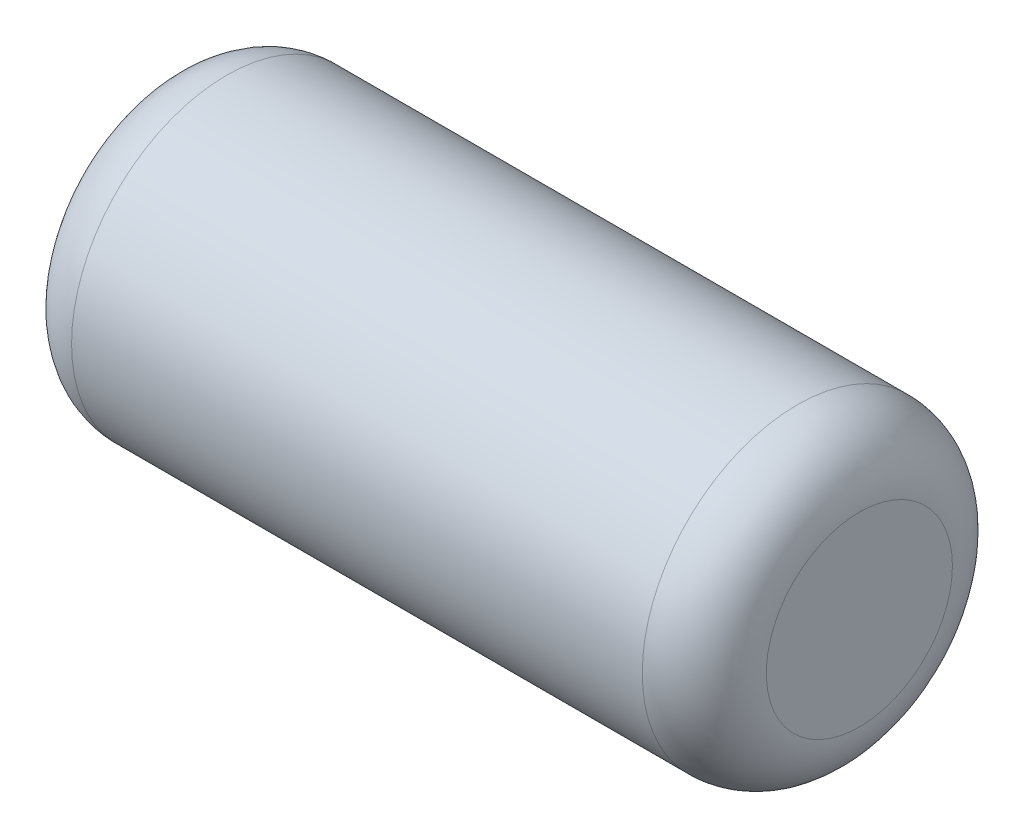
ISO-10303-21;
HEADER;
FILE_DESCRIPTION(('STEP AP214'),'2;1');
FILE_NAME('part.step','',(''),(''),'','','');
FILE_SCHEMA(('AUTOMOTIVE_DESIGN { 1 0 10303 214 1 1 1 1 }'));
ENDSEC;
DATA;
#1=APPLICATION_CONTEXT('core data for automotive mechanical design processes');
#2=APPLICATION_PROTOCOL_DEFINITION('international standard','automotive_design',2000,#1);
#3=PRODUCT_CONTEXT('',#1,'mechanical');
#4=PRODUCT('Part','Part','',(#3));
#5=PRODUCT_RELATED_PRODUCT_CATEGORY('part','',(#4));
#6=PRODUCT_DEFINITION_FORMATION('','',#4);
#7=PRODUCT_DEFINITION_CONTEXT('part definition',#1,'design');
#8=PRODUCT_DEFINITION('design','',#6,#7);
#9=PRODUCT_DEFINITION_SHAPE('','',#8);
#10=(LENGTH_UNIT() NAMED_UNIT(*) SI_UNIT(.MILLI.,.METRE.));
#11=(NAMED_UNIT(*) PLANE_ANGLE_UNIT() SI_UNIT($,.RADIAN.));
#12=(NAMED_UNIT(*) SI_UNIT($,.STERADIAN.) SOLID_ANGLE_UNIT());
#13=UNCERTAINTY_MEASURE_WITH_UNIT(LENGTH_MEASURE(1.E-05),#10,'distance_accuracy_value','');
#14=(GEOMETRIC_REPRESENTATION_CONTEXT(3) GLOBAL_UNCERTAINTY_ASSIGNED_CONTEXT((#13)) GLOBAL_UNIT_ASSIGNED_CONTEXT((#10,
#11,#12)) REPRESENTATION_CONTEXT('',''));
#15=CARTESIAN_POINT('',(0.,0.,0.));
#16=DIRECTION('',(0.,0.,1.));
#17=DIRECTION('',(1.,0.,0.));
#18=AXIS2_PLACEMENT_3D('',#15,#16,#17);
#19=CARTESIAN_POINT('',(284.48,0.,0.));
#20=DIRECTION('',(-1.,0.,0.));
#21=DIRECTION('',(0.,0.,1.));
#22=AXIS2_PLACEMENT_3D('',#19,#20,#21);
#23=CYLINDRICAL_SURFACE('',#22,63.5);
#24=CARTESIAN_POINT('',(259.08,0.,0.));
#25=DIRECTION('',(1.,0.,0.));
#26=DIRECTION('',(0.,0.,-1.));
#27=AXIS2_PLACEMENT_3D('',#24,#25,#26);
#28=CIRCLE('',#27,63.5);
#29=CARTESIAN_POINT('',(259.08,0.,-63.5));
#30=VERTEX_POINT('',#29);
#31=EDGE_CURVE('E45',#30,#30,#28,.F.);
#32=ORIENTED_EDGE('',*,*,#31,.T.);
#33=EDGE_LOOP('',(#32));
#34=FACE_BOUND('',#33,.T.);
#35=CARTESIAN_POINT('',(25.4,0.,0.));
#36=DIRECTION('',(1.,0.,0.));
#37=DIRECTION('',(0.,0.,-1.));
#38=AXIS2_PLACEMENT_3D('',#35,#36,#37);
#39=CIRCLE('',#38,63.5);
#40=CARTESIAN_POINT('',(25.4,0.,-63.5));
#41=VERTEX_POINT('',#40);
#42=EDGE_CURVE('E50',#41,#41,#39,.T.);
#43=ORIENTED_EDGE('',*,*,#42,.T.);
#44=EDGE_LOOP('',(#43));
#45=FACE_BOUND('',#44,.T.);
#46=ADVANCED_FACE('F37',(#34,#45),#23,.T.);
#47=CARTESIAN_POINT('',(284.48,0.,0.));
#48=DIRECTION('',(1.,0.,0.));
#49=DIRECTION('',(0.,0.,-1.));
#50=AXIS2_PLACEMENT_3D('',#47,#48,#49);
#51=PLANE('',#50);
#52=CARTESIAN_POINT('',(284.48,0.,0.));
#53=DIRECTION('',(1.,0.,0.));
#54=DIRECTION('',(0.,0.,-1.));
#55=AXIS2_PLACEMENT_3D('',#52,#53,#54);
#56=CIRCLE('',#55,38.1);
#57=CARTESIAN_POINT('',(284.48,0.,-38.1));
#58=VERTEX_POINT('',#57);
#59=EDGE_CURVE('E55',#58,#58,#56,.T.);
#60=ORIENTED_EDGE('',*,*,#59,.T.);
#61=EDGE_LOOP('',(#60));
#62=FACE_BOUND('',#61,.T.);
#63=ADVANCED_FACE('F62',(#62),#51,.T.);
#64=CARTESIAN_POINT('',(0.,0.,0.));
#65=DIRECTION('',(1.,0.,0.));
#66=DIRECTION('',(0.,0.,-1.));
#67=AXIS2_PLACEMENT_3D('',#64,#65,#66);
#68=PLANE('',#67);
#69=CARTESIAN_POINT('',(0.,0.,0.));
#70=DIRECTION('',(1.,0.,0.));
#71=DIRECTION('',(0.,0.,-1.));
#72=AXIS2_PLACEMENT_3D('',#69,#70,#71);
#73=CIRCLE('',#72,38.1);
#74=CARTESIAN_POINT('',(0.,0.,-38.1));
#75=VERTEX_POINT('',#74);
#76=EDGE_CURVE('E10',#75,#75,#73,.F.);
#77=ORIENTED_EDGE('',*,*,#76,.T.);
#78=EDGE_LOOP('',(#77));
#79=FACE_BOUND('',#78,.T.);
#80=ADVANCED_FACE('F66',(#79),#68,.F.);
#81=CARTESIAN_POINT('',(259.08,0.,0.));
#82=DIRECTION('',(1.,0.,0.));
#83=DIRECTION('',(0.,0.,-1.));
#84=AXIS2_PLACEMENT_3D('',#81,#82,#83);
#85=TOROIDAL_SURFACE('',#84,38.1,25.4);
#86=ORIENTED_EDGE('',*,*,#31,.F.);
#87=EDGE_LOOP('',(#86));
#88=FACE_BOUND('',#87,.T.);
#89=ORIENTED_EDGE('',*,*,#59,.F.);
#90=EDGE_LOOP('',(#89));
#91=FACE_BOUND('',#90,.T.);
#92=ADVANCED_FACE('F64',(#88,#91),#85,.T.);
#93=CARTESIAN_POINT('',(25.4,0.,0.));
#94=DIRECTION('',(1.,0.,0.));
#95=DIRECTION('',(0.,0.,-1.));
#96=AXIS2_PLACEMENT_3D('',#93,#94,#95);
#97=TOROIDAL_SURFACE('',#96,38.1,25.4);
#98=ORIENTED_EDGE('',*,*,#76,.F.);
#99=EDGE_LOOP('',(#98));
#100=FACE_BOUND('',#99,.T.);
#101=ORIENTED_EDGE('',*,*,#42,.F.);
#102=EDGE_LOOP('',(#101));
#103=FACE_BOUND('',#102,.T.);
#104=ADVANCED_FACE('F39',(#100,#103),#97,.T.);
#105=CLOSED_SHELL('',(#46,#63,#80,#92,#104));
#106=MANIFOLD_SOLID_BREP('B2',#105);
#107=ADVANCED_BREP_SHAPE_REPRESENTATION('',(#18,#106),#14);
#108=SHAPE_DEFINITION_REPRESENTATION(#9,#107);
ENDSEC;
END-ISO-10303-21;
